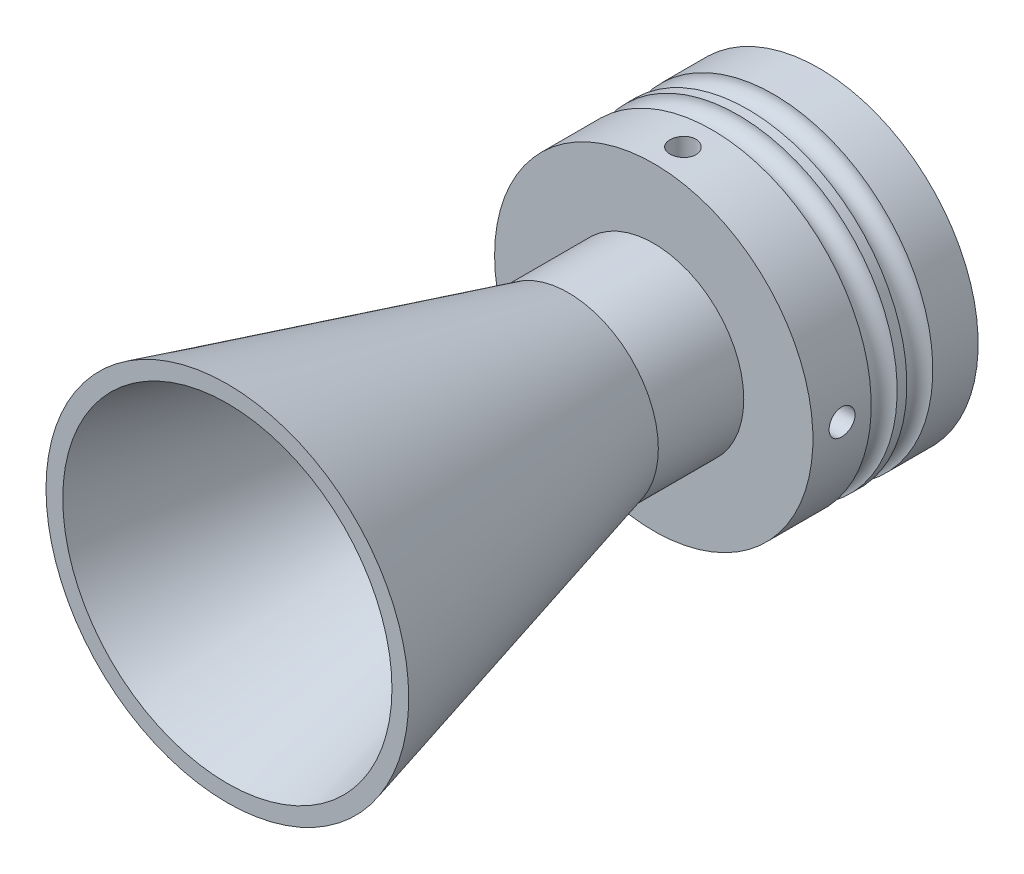
ISO-10303-21;
HEADER;
FILE_DESCRIPTION(('STEP AP214'),'2;1');
FILE_NAME('part.step','',(''),(''),'','','');
FILE_SCHEMA(('AUTOMOTIVE_DESIGN { 1 0 10303 214 1 1 1 1 }'));
ENDSEC;
DATA;
#1=APPLICATION_CONTEXT('core data for automotive mechanical design processes');
#2=APPLICATION_PROTOCOL_DEFINITION('international standard','automotive_design',2000,#1);
#3=PRODUCT_CONTEXT('',#1,'mechanical');
#4=PRODUCT('Part','Part','',(#3));
#5=PRODUCT_RELATED_PRODUCT_CATEGORY('part','',(#4));
#6=PRODUCT_DEFINITION_FORMATION('','',#4);
#7=PRODUCT_DEFINITION_CONTEXT('part definition',#1,'design');
#8=PRODUCT_DEFINITION('design','',#6,#7);
#9=PRODUCT_DEFINITION_SHAPE('','',#8);
#10=(LENGTH_UNIT() NAMED_UNIT(*) SI_UNIT(.MILLI.,.METRE.));
#11=(NAMED_UNIT(*) PLANE_ANGLE_UNIT() SI_UNIT($,.RADIAN.));
#12=(NAMED_UNIT(*) SI_UNIT($,.STERADIAN.) SOLID_ANGLE_UNIT());
#13=UNCERTAINTY_MEASURE_WITH_UNIT(LENGTH_MEASURE(1.E-05),#10,'distance_accuracy_value','');
#14=(GEOMETRIC_REPRESENTATION_CONTEXT(3) GLOBAL_UNCERTAINTY_ASSIGNED_CONTEXT((#13)) GLOBAL_UNIT_ASSIGNED_CONTEXT((#10,
#11,#12)) REPRESENTATION_CONTEXT('',''));
#15=CARTESIAN_POINT('',(0.,0.,0.));
#16=DIRECTION('',(0.,0.,1.));
#17=DIRECTION('',(1.,0.,0.));
#18=AXIS2_PLACEMENT_3D('',#15,#16,#17);
#19=CARTESIAN_POINT('',(0.,0.,-75.3084405577299));
#20=DIRECTION('',(0.,0.,-1.));
#21=DIRECTION('',(-1.,0.,0.));
#22=AXIS2_PLACEMENT_3D('',#19,#20,#21);
#23=CYLINDRICAL_SURFACE('',#22,24.5618);
#24=CARTESIAN_POINT('',(0.,0.,-27.1443538460579));
#25=DIRECTION('',(0.,0.,-1.));
#26=DIRECTION('',(-1.,0.,0.));
#27=AXIS2_PLACEMENT_3D('',#24,#25,#26);
#28=CIRCLE('',#27,24.5618);
#29=CARTESIAN_POINT('',(-24.5618,0.,-27.1443538460579));
#30=VERTEX_POINT('',#29);
#31=EDGE_CURVE('E117',#30,#30,#28,.T.);
#32=ORIENTED_EDGE('',*,*,#31,.F.);
#33=EDGE_LOOP('',(#32));
#34=FACE_BOUND('',#33,.T.);
#35=CARTESIAN_POINT('',(0.,0.,-20.1443538460579));
#36=DIRECTION('',(0.,0.,-1.));
#37=DIRECTION('',(-1.,0.,0.));
#38=AXIS2_PLACEMENT_3D('',#35,#36,#37);
#39=CIRCLE('',#38,24.5618);
#40=CARTESIAN_POINT('',(-24.5618,0.,-20.1443538460579));
#41=VERTEX_POINT('',#40);
#42=EDGE_CURVE('E84',#41,#41,#39,.T.);
#43=ORIENTED_EDGE('',*,*,#42,.T.);
#44=EDGE_LOOP('',(#43));
#45=FACE_BOUND('',#44,.T.);
#46=ADVANCED_FACE('F39',(#34,#45),#23,.T.);
#47=CARTESIAN_POINT('',(0.,0.,-27.1443538460579));
#48=DIRECTION('',(0.,0.,-1.));
#49=DIRECTION('',(-1.,0.,0.));
#50=AXIS2_PLACEMENT_3D('',#47,#48,#49);
#51=CONICAL_SURFACE('',#50,24.5618,0.5235987755983);
#52=CARTESIAN_POINT('',(0.,0.,0.));
#53=DIRECTION('',(0.,0.,-1.));
#54=DIRECTION('',(-1.,0.,0.));
#55=AXIS2_PLACEMENT_3D('',#52,#53,#54);
#56=CIRCLE('',#55,8.89000000000001);
#57=CARTESIAN_POINT('',(-8.89000000000001,0.,0.));
#58=VERTEX_POINT('',#57);
#59=EDGE_CURVE('E114',#58,#58,#56,.T.);
#60=ORIENTED_EDGE('',*,*,#59,.F.);
#61=EDGE_LOOP('',(#60));
#62=FACE_BOUND('',#61,.T.);
#63=ORIENTED_EDGE('',*,*,#31,.T.);
#64=EDGE_LOOP('',(#63));
#65=FACE_BOUND('',#64,.T.);
#66=ADVANCED_FACE('F165',(#62,#65),#51,.F.);
#67=CARTESIAN_POINT('',(0.,0.,-75.3084405577299));
#68=DIRECTION('',(0.,0.,-1.));
#69=DIRECTION('',(-1.,0.,0.));
#70=AXIS2_PLACEMENT_3D('',#67,#68,#69);
#71=CYLINDRICAL_SURFACE('',#70,8.89000000000001);
#72=CARTESIAN_POINT('',(0.,0.,2.54));
#73=DIRECTION('',(0.,0.,-1.));
#74=DIRECTION('',(-1.,0.,0.));
#75=AXIS2_PLACEMENT_3D('',#72,#73,#74);
#76=CIRCLE('',#75,8.89000000000001);
#77=CARTESIAN_POINT('',(-8.89000000000001,0.,2.54));
#78=VERTEX_POINT('',#77);
#79=EDGE_CURVE('E111',#78,#78,#76,.T.);
#80=ORIENTED_EDGE('',*,*,#79,.F.);
#81=EDGE_LOOP('',(#80));
#82=FACE_BOUND('',#81,.T.);
#83=ORIENTED_EDGE('',*,*,#59,.T.);
#84=EDGE_LOOP('',(#83));
#85=FACE_BOUND('',#84,.T.);
#86=ADVANCED_FACE('F170',(#82,#85),#71,.F.);
#87=CARTESIAN_POINT('',(0.,0.,2.54));
#88=DIRECTION('',(0.,0.,1.));
#89=DIRECTION('',(1.,0.,0.));
#90=AXIS2_PLACEMENT_3D('',#87,#88,#89);
#91=CONICAL_SURFACE('',#90,8.89000000000001,0.26179938779915);
#92=CARTESIAN_POINT('',(0.,0.,64.1561588329619));
#93=DIRECTION('',(0.,0.,-1.));
#94=DIRECTION('',(-1.,0.,0.));
#95=AXIS2_PLACEMENT_3D('',#92,#93,#94);
#96=CIRCLE('',#95,25.4);
#97=CARTESIAN_POINT('',(-25.4,0.,64.1561588329619));
#98=VERTEX_POINT('',#97);
#99=EDGE_CURVE('E108',#98,#98,#96,.T.);
#100=ORIENTED_EDGE('',*,*,#99,.F.);
#101=EDGE_LOOP('',(#100));
#102=FACE_BOUND('',#101,.T.);
#103=ORIENTED_EDGE('',*,*,#79,.T.);
#104=EDGE_LOOP('',(#103));
#105=FACE_BOUND('',#104,.T.);
#106=ADVANCED_FACE('F182',(#102,#105),#91,.F.);
#107=CARTESIAN_POINT('',(25.4,0.,64.156158832962));
#108=DIRECTION('',(0.,0.,-1.));
#109=DIRECTION('',(-1.,0.,0.));
#110=AXIS2_PLACEMENT_3D('',#107,#108,#109);
#111=PLANE('',#110);
#112=CARTESIAN_POINT('',(0.,0.,64.1561588329619));
#113=DIRECTION('',(0.,0.,-1.));
#114=DIRECTION('',(-1.,0.,0.));
#115=AXIS2_PLACEMENT_3D('',#112,#113,#114);
#116=CIRCLE('',#115,27.9881904510252);
#117=CARTESIAN_POINT('',(-27.9881904510252,0.,64.1561588329619));
#118=VERTEX_POINT('',#117);
#119=EDGE_CURVE('E105',#118,#118,#116,.T.);
#120=ORIENTED_EDGE('',*,*,#119,.F.);
#121=EDGE_LOOP('',(#120));
#122=FACE_BOUND('',#121,.T.);
#123=ORIENTED_EDGE('',*,*,#99,.T.);
#124=EDGE_LOOP('',(#123));
#125=FACE_BOUND('',#124,.T.);
#126=ADVANCED_FACE('F189',(#122,#125),#111,.F.);
#127=CARTESIAN_POINT('',(0.,0.,64.1561588329619));
#128=DIRECTION('',(0.,0.,1.));
#129=DIRECTION('',(1.,0.,0.));
#130=AXIS2_PLACEMENT_3D('',#127,#128,#129);
#131=CONICAL_SURFACE('',#130,27.9881904510252,0.261799387799151);
#132=CARTESIAN_POINT('',(0.,0.,11.5409957749537));
#133=DIRECTION('',(0.,0.,-1.));
#134=DIRECTION('',(-1.,0.,0.));
#135=AXIS2_PLACEMENT_3D('',#132,#133,#134);
#136=CIRCLE('',#135,13.89);
#137=CARTESIAN_POINT('',(-13.89,0.,11.5409957749537));
#138=VERTEX_POINT('',#137);
#139=EDGE_CURVE('E102',#138,#138,#136,.T.);
#140=ORIENTED_EDGE('',*,*,#139,.F.);
#141=EDGE_LOOP('',(#140));
#142=FACE_BOUND('',#141,.T.);
#143=ORIENTED_EDGE('',*,*,#119,.T.);
#144=EDGE_LOOP('',(#143));
#145=FACE_BOUND('',#144,.T.);
#146=ADVANCED_FACE('F193',(#142,#145),#131,.T.);
#147=CARTESIAN_POINT('',(0.,0.,-75.3084405577299));
#148=DIRECTION('',(0.,0.,-1.));
#149=DIRECTION('',(-1.,0.,0.));
#150=AXIS2_PLACEMENT_3D('',#147,#148,#149);
#151=CYLINDRICAL_SURFACE('',#150,13.89);
#152=CARTESIAN_POINT('',(0.,0.,-1.64435384605786));
#153=DIRECTION('',(0.,0.,-1.));
#154=DIRECTION('',(-1.,0.,0.));
#155=AXIS2_PLACEMENT_3D('',#152,#153,#154);
#156=CIRCLE('',#155,13.89);
#157=CARTESIAN_POINT('',(-13.89,0.,-1.64435384605786));
#158=VERTEX_POINT('',#157);
#159=EDGE_CURVE('E99',#158,#158,#156,.T.);
#160=ORIENTED_EDGE('',*,*,#159,.F.);
#161=EDGE_LOOP('',(#160));
#162=FACE_BOUND('',#161,.T.);
#163=ORIENTED_EDGE('',*,*,#139,.T.);
#164=EDGE_LOOP('',(#163));
#165=FACE_BOUND('',#164,.T.);
#166=ADVANCED_FACE('F197',(#162,#165),#151,.T.);
#167=CARTESIAN_POINT('',(13.89,0.,-1.64435384605787));
#168=DIRECTION('',(0.,0.,-1.));
#169=DIRECTION('',(-1.,0.,0.));
#170=AXIS2_PLACEMENT_3D('',#167,#168,#169);
#171=PLANE('',#170);
#172=CARTESIAN_POINT('',(0.,0.,-1.64435384605786));
#173=DIRECTION('',(0.,0.,-1.));
#174=DIRECTION('',(-1.,0.,0.));
#175=AXIS2_PLACEMENT_3D('',#172,#173,#174);
#176=CIRCLE('',#175,24.5618);
#177=CARTESIAN_POINT('',(-24.5618,0.,-1.64435384605786));
#178=VERTEX_POINT('',#177);
#179=EDGE_CURVE('E96',#178,#178,#176,.T.);
#180=ORIENTED_EDGE('',*,*,#179,.F.);
#181=EDGE_LOOP('',(#180));
#182=FACE_BOUND('',#181,.T.);
#183=ORIENTED_EDGE('',*,*,#159,.T.);
#184=EDGE_LOOP('',(#183));
#185=FACE_BOUND('',#184,.T.);
#186=ADVANCED_FACE('F160',(#182,#185),#171,.F.);
#187=CARTESIAN_POINT('',(0.,0.,-75.3084405577299));
#188=DIRECTION('',(0.,0.,-1.));
#189=DIRECTION('',(-1.,0.,0.));
#190=AXIS2_PLACEMENT_3D('',#187,#188,#189);
#191=CYLINDRICAL_SURFACE('',#190,24.5618);
#192=CARTESIAN_POINT('',(0.,24.5618,-4.14435384605787));
#193=CARTESIAN_POINT('',(-0.112141593484284,24.5617989315381,-4.14435874811145));
#194=CARTESIAN_POINT('',(-0.224359753682799,24.5610238041837,-4.15381737125759));
#195=CARTESIAN_POINT('',(-0.445691870877797,24.5580061929669,-4.19141078284148));
#196=CARTESIAN_POINT('',(-0.554802154040363,24.5557620420353,-4.21956678986824));
#197=CARTESIAN_POINT('',(-0.76668086212744,24.5500600119672,-4.29373593751335));
#198=CARTESIAN_POINT('',(-0.869452812845445,24.5466028148983,-4.33973904465828));
#199=CARTESIAN_POINT('',(-1.06579142249106,24.5388625155217,-4.4482787512852));
#200=CARTESIAN_POINT('',(-1.15936005884735,24.5345795912182,-4.51081178844397));
#201=CARTESIAN_POINT('',(-1.33488912846614,24.5256568334725,-4.65080123813603));
#202=CARTESIAN_POINT('',(-1.4168240164639,24.5210162481033,-4.72828963608943));
#203=CARTESIAN_POINT('',(-1.56654063553194,24.5119075106196,-4.89592272796304));
#204=CARTESIAN_POINT('',(-1.63432174808216,24.5074393660477,-4.98606797469985));
#205=CARTESIAN_POINT('',(-1.75389264893964,24.4991732510783,-5.17660979689365));
#206=CARTESIAN_POINT('',(-1.80566007898563,24.4953762208288,-5.27702044713277));
#207=CARTESIAN_POINT('',(-1.89159128999419,24.4888907359153,-5.4851446433521));
#208=CARTESIAN_POINT('',(-1.92575536924911,24.4862022624667,-5.59285806555036));
#209=CARTESIAN_POINT('',(-1.97543622928937,24.4822445277374,-5.81227496931943));
#210=CARTESIAN_POINT('',(-1.99099451343345,24.4809721081522,-5.92396899570661));
#211=CARTESIAN_POINT('',(-2.00315034735945,24.4799805359079,-6.14838983226583));
#212=CARTESIAN_POINT('',(-1.99974823837185,24.4802613552951,-6.26111662381474));
#213=CARTESIAN_POINT('',(-1.97411417310895,24.4823416649176,-6.48411883851087));
#214=CARTESIAN_POINT('',(-1.95192730226052,24.4841375188718,-6.59439948287932));
#215=CARTESIAN_POINT('',(-1.88942355030596,24.489039839819,-6.80966628066148));
#216=CARTESIAN_POINT('',(-1.84910649915756,24.4921463191043,-6.91465238440762));
#217=CARTESIAN_POINT('',(-1.75143628711684,24.4993240464494,-7.11649373201899));
#218=CARTESIAN_POINT('',(-1.69406287524686,24.5033964401687,-7.21333913412472));
#219=CARTESIAN_POINT('',(-1.56392316815058,24.5120460643315,-7.39604236984987));
#220=CARTESIAN_POINT('',(-1.49115657548718,24.5166233045293,-7.48189999110476));
#221=CARTESIAN_POINT('',(-1.33204310256705,24.5257830444986,-7.64045264753241));
#222=CARTESIAN_POINT('',(-1.24565724111137,24.5303655206868,-7.71310857074023));
#223=CARTESIAN_POINT('',(-1.06189347076513,24.5390066648017,-7.84289306470512));
#224=CARTESIAN_POINT('',(-0.964515554959158,24.5430653323989,-7.90002162569339));
#225=CARTESIAN_POINT('',(-0.761506630046313,24.5502022750295,-7.99712720033692));
#226=CARTESIAN_POINT('',(-0.655874801100778,24.5532804525189,-8.03710250763984));
#227=CARTESIAN_POINT('',(-0.439368106974057,24.5581084499974,-8.0987395689671));
#228=CARTESIAN_POINT('',(-0.328493345726816,24.5598582963071,-8.12040168586476));
#229=CARTESIAN_POINT('',(-0.104987164495274,24.5618290904761,-8.14474848032969));
#230=CARTESIAN_POINT('',(0.0076383333010981,24.5620543911013,-8.14748718703832));
#231=CARTESIAN_POINT('',(0.231746894714884,24.5609623288912,-8.1340509187828));
#232=CARTESIAN_POINT('',(0.343229968490891,24.5596449797854,-8.11787611214773));
#233=CARTESIAN_POINT('',(0.561735222455953,24.5556185842572,-8.0671167370458));
#234=CARTESIAN_POINT('',(0.668763251956354,24.5529114291862,-8.03255718559925));
#235=CARTESIAN_POINT('',(0.875501407121716,24.5464095806382,-7.94603487634939));
#236=CARTESIAN_POINT('',(0.975211422133711,24.5426148707209,-7.89407185546079));
#237=CARTESIAN_POINT('',(1.16472918322411,24.5343525505745,-7.77408168900205));
#238=CARTESIAN_POINT('',(1.25451418216037,24.5298834479219,-7.70601871994223));
#239=CARTESIAN_POINT('',(1.4214036910347,24.5207795496767,-7.55581250407189));
#240=CARTESIAN_POINT('',(1.49850799057751,24.5161447513364,-7.47366902368693));
#241=CARTESIAN_POINT('',(1.63803248389374,24.5072189736169,-7.29739922260193));
#242=CARTESIAN_POINT('',(1.70041744147482,24.502928835165,-7.20324496259505));
#243=CARTESIAN_POINT('',(1.80849082929525,24.4951899013911,-7.00576550443095));
#244=CARTESIAN_POINT('',(1.85417941976015,24.4917410979954,-6.902440394293));
#245=CARTESIAN_POINT('',(1.92750301656592,24.4860799528597,-6.68967742881287));
#246=CARTESIAN_POINT('',(1.9551596554701,24.4838661300012,-6.58024706962489));
#247=CARTESIAN_POINT('',(1.99170473323817,24.4809205894277,-6.35827713287327));
#248=CARTESIAN_POINT('',(2.00059351439776,24.480188844682,-6.2457376120537));
#249=CARTESIAN_POINT('',(1.9993466786577,24.480290681317,-6.0210941229522));
#250=CARTESIAN_POINT('',(1.98926642817877,24.4811197071557,-5.90898984114361));
#251=CARTESIAN_POINT('',(1.95048305264641,24.4842399975029,-5.68807196734506));
#252=CARTESIAN_POINT('',(1.92177989854078,24.4865312642925,-5.57925838048896));
#253=CARTESIAN_POINT('',(1.84657937422165,24.4923166738984,-5.36800665859296));
#254=CARTESIAN_POINT('',(1.80008293099049,24.4958107540505,-5.26556819174969));
#255=CARTESIAN_POINT('',(1.69062199128293,24.5036081825676,-5.06994234042215));
#256=CARTESIAN_POINT('',(1.62765777053335,24.5079115173826,-4.97675480108181));
#257=CARTESIAN_POINT('',(1.48684069912956,24.5168574897544,-4.80199285502212));
#258=CARTESIAN_POINT('',(1.40894691182899,24.5215010380279,-4.72045148042844));
#259=CARTESIAN_POINT('',(1.24055490572318,24.5305959311298,-4.571568019929));
#260=CARTESIAN_POINT('',(1.15005363825368,24.5350472291275,-4.50422937837309));
#261=CARTESIAN_POINT('',(0.958848784812308,24.5432637395329,-4.38557692814964));
#262=CARTESIAN_POINT('',(0.858127172153495,24.5470277057108,-4.33429210946005));
#263=CARTESIAN_POINT('',(0.649541116056349,24.55343067707,-4.24942754205893));
#264=CARTESIAN_POINT('',(0.541685061367675,24.5560709772283,-4.2158274018796));
#265=CARTESIAN_POINT('',(0.360991871524487,24.5592498609918,-4.17586145108481));
#266=CARTESIAN_POINT('',(0.289317448558753,24.5602018203546,-4.16406175927214));
#267=CARTESIAN_POINT('',(0.145106036745532,24.5614772347798,-4.14830638051456));
#268=CARTESIAN_POINT('',(0.0725690500678836,24.5618006914229,-4.14435067384174));
#269=CARTESIAN_POINT('',(0.,24.5618,-4.14435384605787));
#270=B_SPLINE_CURVE_WITH_KNOTS('',3,(#192,#193,#194,#195,#196,#197,#198,#199,#200,#201,#202,
#203,#204,#205,#206,#207,#208,#209,#210,#211,#212,#213,#214,#215,#216,#217,#218,#219,#220,#221,
#222,#223,#224,#225,#226,#227,#228,#229,#230,#231,#232,#233,#234,#235,#236,#237,#238,#239,#240,
#241,#242,#243,#244,#245,#246,#247,#248,#249,#250,#251,#252,#253,#254,#255,#256,#257,#258,#259,
#260,#261,#262,#263,#264,#265,#266,#267,#268,#269),.UNSPECIFIED.,.T.,.F.,(4,2,2,2,2,2,2,2,2,2,2,
2,2,2,2,2,2,2,2,2,2,2,2,2,2,2,2,2,2,2,2,2,2,2,2,2,2,2,4),(0.,0.336159827874987,
0.672701797698236,1.0090548402966,1.34533545531821,1.68234341603319,2.01936610091733,
2.35685723401653,2.69434264807169,3.03107383142367,3.36779895463901,3.70371818528233,
4.03964056656492,4.37596339151666,4.71229271571156,5.04960277158238,5.38691303966608,
5.7242568545518,6.06159398486005,6.39796756819627,6.73433815785192,7.07025219804378,
7.40617131642046,7.74284502783746,8.07952432470397,8.41700159120252,8.75447561903851,
9.09154403758109,9.42860630848187,9.76468629459758,10.1007668050078,10.4368298089137,
10.7728871863381,11.1098795630184,11.4469535710586,11.7846328017556,12.1219218108085,
12.3394580520542,12.5569937461879),.UNSPECIFIED.);
#271=CARTESIAN_POINT('',(0.,24.5618,-4.14435384605787));
#272=VERTEX_POINT('',#271);
#273=EDGE_CURVE('E11',#272,#272,#270,.T.);
#274=ORIENTED_EDGE('',*,*,#273,.T.);
#275=EDGE_LOOP('',(#274));
#276=FACE_BOUND('',#275,.T.);
#277=CARTESIAN_POINT('',(24.5618,0.,-8.14435384605786));
#278=CARTESIAN_POINT('',(24.5617989315381,-0.112141593484284,-8.14434894400429));
#279=CARTESIAN_POINT('',(24.5610238041837,-0.224359753682799,-8.13489032085814));
#280=CARTESIAN_POINT('',(24.5580061929669,-0.445691870877796,-8.09729690927425));
#281=CARTESIAN_POINT('',(24.5557620420353,-0.554802154040362,-8.06914090224749));
#282=CARTESIAN_POINT('',(24.5500600119672,-0.766680862127437,-7.99497175460237));
#283=CARTESIAN_POINT('',(24.5466028148983,-0.86945281284544,-7.94896864745743));
#284=CARTESIAN_POINT('',(24.5388625155217,-1.06579142249106,-7.84042894083051));
#285=CARTESIAN_POINT('',(24.5345795912182,-1.15936005884734,-7.77789590367174));
#286=CARTESIAN_POINT('',(24.5256568334725,-1.33488912846613,-7.63790645397968));
#287=CARTESIAN_POINT('',(24.5210162481033,-1.41682401646388,-7.56041805602627));
#288=CARTESIAN_POINT('',(24.5119075106196,-1.56654063553193,-7.39278496415266));
#289=CARTESIAN_POINT('',(24.5074393660477,-1.63432174808214,-7.30263971741585));
#290=CARTESIAN_POINT('',(24.4991732510783,-1.75389264893961,-7.11209789522205));
#291=CARTESIAN_POINT('',(24.4953762208288,-1.8056600789856,-7.01168724498293));
#292=CARTESIAN_POINT('',(24.4888907359153,-1.89159128999416,-6.80356304876359));
#293=CARTESIAN_POINT('',(24.4862022624667,-1.92575536924908,-6.69584962656533));
#294=CARTESIAN_POINT('',(24.4822445277374,-1.97543622928933,-6.47643272279626));
#295=CARTESIAN_POINT('',(24.4809721081522,-1.99099451343341,-6.36473869640908));
#296=CARTESIAN_POINT('',(24.4799805359079,-2.00315034735941,-6.14031785984986));
#297=CARTESIAN_POINT('',(24.4802613552951,-1.99974823837181,-6.02759106830096));
#298=CARTESIAN_POINT('',(24.4823416649176,-1.9741141731089,-5.80458885360483));
#299=CARTESIAN_POINT('',(24.4841375188718,-1.95192730226047,-5.69430820923637));
#300=CARTESIAN_POINT('',(24.489039839819,-1.88942355030591,-5.47904141145422));
#301=CARTESIAN_POINT('',(24.4921463191043,-1.8491064991575,-5.37405530770808));
#302=CARTESIAN_POINT('',(24.4993240464494,-1.75143628711678,-5.17221396009671));
#303=CARTESIAN_POINT('',(24.5033964401687,-1.69406287524679,-5.07536855799098));
#304=CARTESIAN_POINT('',(24.5120460643315,-1.56392316815051,-4.89266532226583));
#305=CARTESIAN_POINT('',(24.5166233045293,-1.4911565754871,-4.80680770101095));
#306=CARTESIAN_POINT('',(24.5257830444986,-1.33204310256698,-4.6482550445833));
#307=CARTESIAN_POINT('',(24.5303655206868,-1.24565724111129,-4.57559912137548));
#308=CARTESIAN_POINT('',(24.5390066648017,-1.06189347076505,-4.44581462741059));
#309=CARTESIAN_POINT('',(24.5430653323989,-0.964515554959076,-4.38868606642232));
#310=CARTESIAN_POINT('',(24.5502022750295,-0.761506630046229,-4.2915804917788));
#311=CARTESIAN_POINT('',(24.5532804525189,-0.655874801100693,-4.25160518447588));
#312=CARTESIAN_POINT('',(24.5581084499974,-0.439368106973971,-4.18996812314863));
#313=CARTESIAN_POINT('',(24.5598582963071,-0.32849334572673,-4.16830600625096));
#314=CARTESIAN_POINT('',(24.5618290904761,-0.104987164495188,-4.14395921178604));
#315=CARTESIAN_POINT('',(24.5620543911013,0.0076383333011845,-4.14122050507742));
#316=CARTESIAN_POINT('',(24.5609623288912,0.231746894714971,-4.15465677333293));
#317=CARTESIAN_POINT('',(24.5596449797854,0.343229968490977,-4.17083157996802));
#318=CARTESIAN_POINT('',(24.5556185842572,0.561735222456038,-4.22159095506995));
#319=CARTESIAN_POINT('',(24.5529114291862,0.668763251956438,-4.2561505065165));
#320=CARTESIAN_POINT('',(24.5464095806382,0.875501407121798,-4.34267281576636));
#321=CARTESIAN_POINT('',(24.5426148707209,0.975211422133793,-4.39463583665496));
#322=CARTESIAN_POINT('',(24.5343525505745,1.16472918322419,-4.51462600311371));
#323=CARTESIAN_POINT('',(24.5298834479219,1.25451418216045,-4.58268897217353));
#324=CARTESIAN_POINT('',(24.5207795496767,1.42140369103478,-4.73289518804387));
#325=CARTESIAN_POINT('',(24.5161447513364,1.49850799057759,-4.81503866842883));
#326=CARTESIAN_POINT('',(24.5072189736169,1.63803248389381,-4.99130846951384));
#327=CARTESIAN_POINT('',(24.502928835165,1.70041744147489,-5.08546272952072));
#328=CARTESIAN_POINT('',(24.4951899013911,1.80849082929531,-5.28294218768482));
#329=CARTESIAN_POINT('',(24.4917410979953,1.85417941976021,-5.38626729782277));
#330=CARTESIAN_POINT('',(24.4860799528597,1.92750301656598,-5.5990302633029));
#331=CARTESIAN_POINT('',(24.4838661300012,1.95515965547015,-5.70846062249088));
#332=CARTESIAN_POINT('',(24.4809205894277,1.99170473323822,-5.9304305592425));
#333=CARTESIAN_POINT('',(24.480188844682,2.00059351439781,-6.04297008006208));
#334=CARTESIAN_POINT('',(24.480290681317,1.99934667865775,-6.26761356916358));
#335=CARTESIAN_POINT('',(24.4811197071557,1.98926642817881,-6.37971785097217));
#336=CARTESIAN_POINT('',(24.4842399975029,1.95048305264644,-6.60063572477071));
#337=CARTESIAN_POINT('',(24.4865312642924,1.92177989854081,-6.70944931162682));
#338=CARTESIAN_POINT('',(24.4923166738984,1.84657937422168,-6.92070103352282));
#339=CARTESIAN_POINT('',(24.4958107540505,1.80008293099051,-7.02313950036609));
#340=CARTESIAN_POINT('',(24.5036081825676,1.69062199128295,-7.21876535169362));
#341=CARTESIAN_POINT('',(24.5079115173826,1.62765777053337,-7.31195289103396));
#342=CARTESIAN_POINT('',(24.5168574897544,1.48684069912958,-7.48671483709364));
#343=CARTESIAN_POINT('',(24.5215010380278,1.408946911829,-7.56825621168733));
#344=CARTESIAN_POINT('',(24.5305959311298,1.24055490572319,-7.71713967218677));
#345=CARTESIAN_POINT('',(24.5350472291275,1.15005363825369,-7.78447831374267));
#346=CARTESIAN_POINT('',(24.5432637395329,0.958848784812313,-7.90313076396612));
#347=CARTESIAN_POINT('',(24.5470277057108,0.858127172153499,-7.9544155826557));
#348=CARTESIAN_POINT('',(24.55343067707,0.649541116056351,-8.03928015005682));
#349=CARTESIAN_POINT('',(24.5560709772283,0.541685061367677,-8.07288029023615));
#350=CARTESIAN_POINT('',(24.5592498609918,0.360991871524487,-8.11284624103093));
#351=CARTESIAN_POINT('',(24.5602018203546,0.289317448558754,-8.1246459328436));
#352=CARTESIAN_POINT('',(24.5614772347798,0.145106036745533,-8.14040131160118));
#353=CARTESIAN_POINT('',(24.5618006914229,0.0725690500678837,-8.14435701827399));
#354=CARTESIAN_POINT('',(24.5618,0.,-8.14435384605786));
#355=B_SPLINE_CURVE_WITH_KNOTS('',3,(#277,#278,#279,#280,#281,#282,#283,#284,#285,#286,#287,
#288,#289,#290,#291,#292,#293,#294,#295,#296,#297,#298,#299,#300,#301,#302,#303,#304,#305,#306,
#307,#308,#309,#310,#311,#312,#313,#314,#315,#316,#317,#318,#319,#320,#321,#322,#323,#324,#325,
#326,#327,#328,#329,#330,#331,#332,#333,#334,#335,#336,#337,#338,#339,#340,#341,#342,#343,#344,
#345,#346,#347,#348,#349,#350,#351,#352,#353,#354),.UNSPECIFIED.,.T.,.F.,(4,2,2,2,2,2,2,2,2,2,2,
2,2,2,2,2,2,2,2,2,2,2,2,2,2,2,2,2,2,2,2,2,2,2,2,2,2,2,4),(0.,0.336159827874987,
0.672701797698236,1.0090548402966,1.34533545531821,1.68234341603319,2.01936610091733,
2.35685723401653,2.69434264807169,3.03107383142367,3.36779895463901,3.70371818528233,
4.03964056656492,4.37596339151666,4.71229271571156,5.04960277158238,5.38691303966608,
5.72425685455181,6.06159398486005,6.39796756819628,6.73433815785193,7.07025219804378,
7.40617131642046,7.74284502783746,8.07952432470397,8.41700159120252,8.75447561903851,
9.0915440375811,9.42860630848187,9.76468629459758,10.1007668050078,10.4368298089137,
10.7728871863381,11.1098795630184,11.4469535710586,11.7846328017556,12.1219218108085,
12.3394580520542,12.556993746188),.UNSPECIFIED.);
#356=CARTESIAN_POINT('',(24.5618,0.,-8.14435384605786));
#357=VERTEX_POINT('',#356);
#358=EDGE_CURVE('E51',#357,#357,#355,.T.);
#359=ORIENTED_EDGE('',*,*,#358,.T.);
#360=EDGE_LOOP('',(#359));
#361=FACE_BOUND('',#360,.T.);
#362=CARTESIAN_POINT('',(0.,-24.5618,-8.14435384605786));
#363=CARTESIAN_POINT('',(-0.112141593484284,-24.5617989315381,-8.14434894400428));
#364=CARTESIAN_POINT('',(-0.224359753682799,-24.5610238041837,-8.13489032085813));
#365=CARTESIAN_POINT('',(-0.445691870877797,-24.5580061929669,-8.09729690927425));
#366=CARTESIAN_POINT('',(-0.554802154040364,-24.5557620420353,-8.06914090224749));
#367=CARTESIAN_POINT('',(-0.76668086212744,-24.5500600119672,-7.99497175460238));
#368=CARTESIAN_POINT('',(-0.869452812845446,-24.5466028148983,-7.94896864745744));
#369=CARTESIAN_POINT('',(-1.06579142249106,-24.5388625155217,-7.84042894083053));
#370=CARTESIAN_POINT('',(-1.15936005884735,-24.5345795912182,-7.77789590367176));
#371=CARTESIAN_POINT('',(-1.33488912846614,-24.5256568334725,-7.6379064539797));
#372=CARTESIAN_POINT('',(-1.4168240164639,-24.5210162481033,-7.5604180560263));
#373=CARTESIAN_POINT('',(-1.56654063553194,-24.5119075106196,-7.39278496415268));
#374=CARTESIAN_POINT('',(-1.63432174808216,-24.5074393660477,-7.30263971741587));
#375=CARTESIAN_POINT('',(-1.75389264893964,-24.4991732510783,-7.11209789522208));
#376=CARTESIAN_POINT('',(-1.80566007898563,-24.4953762208288,-7.01168724498296));
#377=CARTESIAN_POINT('',(-1.89159128999419,-24.4888907359153,-6.80356304876363));
#378=CARTESIAN_POINT('',(-1.92575536924911,-24.4862022624667,-6.69584962656537));
#379=CARTESIAN_POINT('',(-1.97543622928937,-24.4822445277374,-6.47643272279629));
#380=CARTESIAN_POINT('',(-1.99099451343345,-24.4809721081522,-6.36473869640912));
#381=CARTESIAN_POINT('',(-2.00315034735945,-24.4799805359079,-6.14031785984989));
#382=CARTESIAN_POINT('',(-1.99974823837185,-24.4802613552951,-6.02759106830099));
#383=CARTESIAN_POINT('',(-1.97411417310895,-24.4823416649176,-5.80458885360486));
#384=CARTESIAN_POINT('',(-1.95192730226052,-24.4841375188718,-5.69430820923641));
#385=CARTESIAN_POINT('',(-1.88942355030596,-24.489039839819,-5.47904141145425));
#386=CARTESIAN_POINT('',(-1.84910649915756,-24.4921463191043,-5.37405530770811));
#387=CARTESIAN_POINT('',(-1.75143628711684,-24.4993240464494,-5.17221396009674));
#388=CARTESIAN_POINT('',(-1.69406287524686,-24.5033964401687,-5.07536855799101));
#389=CARTESIAN_POINT('',(-1.56392316815058,-24.5120460643315,-4.89266532226586));
#390=CARTESIAN_POINT('',(-1.49115657548718,-24.5166233045293,-4.80680770101097));
#391=CARTESIAN_POINT('',(-1.33204310256705,-24.5257830444986,-4.64825504458332));
#392=CARTESIAN_POINT('',(-1.24565724111137,-24.5303655206868,-4.5755991213755));
#393=CARTESIAN_POINT('',(-1.06189347076513,-24.5390066648017,-4.4458146274106));
#394=CARTESIAN_POINT('',(-0.964515554959157,-24.5430653323989,-4.38868606642233));
#395=CARTESIAN_POINT('',(-0.761506630046313,-24.5502022750295,-4.29158049177881));
#396=CARTESIAN_POINT('',(-0.655874801100778,-24.5532804525189,-4.25160518447589));
#397=CARTESIAN_POINT('',(-0.439368106974057,-24.5581084499974,-4.18996812314863));
#398=CARTESIAN_POINT('',(-0.328493345726817,-24.5598582963071,-4.16830600625096));
#399=CARTESIAN_POINT('',(-0.104987164495276,-24.5618290904761,-4.14395921178603));
#400=CARTESIAN_POINT('',(0.00763833330109701,-24.5620543911013,-4.14122050507741));
#401=CARTESIAN_POINT('',(0.231746894714884,-24.5609623288912,-4.15465677333292));
#402=CARTESIAN_POINT('',(0.343229968490891,-24.5596449797854,-4.170831579968));
#403=CARTESIAN_POINT('',(0.561735222455953,-24.5556185842572,-4.22159095506993));
#404=CARTESIAN_POINT('',(0.668763251956355,-24.5529114291862,-4.25615050651648));
#405=CARTESIAN_POINT('',(0.875501407121717,-24.5464095806382,-4.34267281576633));
#406=CARTESIAN_POINT('',(0.975211422133712,-24.5426148707209,-4.39463583665493));
#407=CARTESIAN_POINT('',(1.16472918322411,-24.5343525505745,-4.51462600311368));
#408=CARTESIAN_POINT('',(1.25451418216037,-24.5298834479219,-4.5826889721735));
#409=CARTESIAN_POINT('',(1.4214036910347,-24.5207795496767,-4.73289518804384));
#410=CARTESIAN_POINT('',(1.49850799057751,-24.5161447513364,-4.81503866842879));
#411=CARTESIAN_POINT('',(1.63803248389374,-24.5072189736169,-4.99130846951379));
#412=CARTESIAN_POINT('',(1.70041744147482,-24.502928835165,-5.08546272952068));
#413=CARTESIAN_POINT('',(1.80849082929525,-24.4951899013911,-5.28294218768477));
#414=CARTESIAN_POINT('',(1.85417941976015,-24.4917410979954,-5.38626729782273));
#415=CARTESIAN_POINT('',(1.92750301656592,-24.4860799528597,-5.59903026330285));
#416=CARTESIAN_POINT('',(1.9551596554701,-24.4838661300012,-5.70846062249083));
#417=CARTESIAN_POINT('',(1.99170473323817,-24.4809205894277,-5.93043055924245));
#418=CARTESIAN_POINT('',(2.00059351439776,-24.480188844682,-6.04297008006203));
#419=CARTESIAN_POINT('',(1.9993466786577,-24.480290681317,-6.26761356916353));
#420=CARTESIAN_POINT('',(1.98926642817877,-24.4811197071557,-6.37971785097212));
#421=CARTESIAN_POINT('',(1.95048305264641,-24.4842399975029,-6.60063572477067));
#422=CARTESIAN_POINT('',(1.92177989854078,-24.4865312642925,-6.70944931162677));
#423=CARTESIAN_POINT('',(1.84657937422165,-24.4923166738984,-6.92070103352277));
#424=CARTESIAN_POINT('',(1.80008293099048,-24.4958107540505,-7.02313950036604));
#425=CARTESIAN_POINT('',(1.69062199128293,-24.5036081825676,-7.21876535169358));
#426=CARTESIAN_POINT('',(1.62765777053335,-24.5079115173826,-7.31195289103392));
#427=CARTESIAN_POINT('',(1.48684069912956,-24.5168574897544,-7.48671483709361));
#428=CARTESIAN_POINT('',(1.40894691182899,-24.5215010380279,-7.56825621168729));
#429=CARTESIAN_POINT('',(1.24055490572318,-24.5305959311298,-7.71713967218673));
#430=CARTESIAN_POINT('',(1.15005363825368,-24.5350472291275,-7.78447831374263));
#431=CARTESIAN_POINT('',(0.958848784812307,-24.5432637395329,-7.90313076396609));
#432=CARTESIAN_POINT('',(0.858127172153495,-24.5470277057108,-7.95441558265568));
#433=CARTESIAN_POINT('',(0.649541116056348,-24.55343067707,-8.0392801500568));
#434=CARTESIAN_POINT('',(0.541685061367675,-24.5560709772283,-8.07288029023613));
#435=CARTESIAN_POINT('',(0.360991871524485,-24.5592498609918,-8.11284624103092));
#436=CARTESIAN_POINT('',(0.289317448558752,-24.5602018203546,-8.12464593284358));
#437=CARTESIAN_POINT('',(0.145106036745531,-24.5614772347798,-8.14040131160117));
#438=CARTESIAN_POINT('',(0.072569050067883,-24.5618006914229,-8.14435701827398));
#439=CARTESIAN_POINT('',(0.,-24.5618,-8.14435384605786));
#440=B_SPLINE_CURVE_WITH_KNOTS('',3,(#362,#363,#364,#365,#366,#367,#368,#369,#370,#371,#372,
#373,#374,#375,#376,#377,#378,#379,#380,#381,#382,#383,#384,#385,#386,#387,#388,#389,#390,#391,
#392,#393,#394,#395,#396,#397,#398,#399,#400,#401,#402,#403,#404,#405,#406,#407,#408,#409,#410,
#411,#412,#413,#414,#415,#416,#417,#418,#419,#420,#421,#422,#423,#424,#425,#426,#427,#428,#429,
#430,#431,#432,#433,#434,#435,#436,#437,#438,#439),.UNSPECIFIED.,.T.,.F.,(4,2,2,2,2,2,2,2,2,2,2,
2,2,2,2,2,2,2,2,2,2,2,2,2,2,2,2,2,2,2,2,2,2,2,2,2,2,2,4),(0.,0.336159827874987,
0.672701797698236,1.0090548402966,1.34533545531821,1.68234341603319,2.01936610091733,
2.35685723401653,2.69434264807169,3.03107383142367,3.36779895463901,3.70371818528233,
4.03964056656492,4.37596339151666,4.71229271571157,5.04960277158238,5.38691303966608,
5.72425685455181,6.06159398486005,6.39796756819628,6.73433815785193,7.07025219804378,
7.40617131642046,7.74284502783746,8.07952432470397,8.41700159120252,8.75447561903851,
9.0915440375811,9.42860630848187,9.76468629459758,10.1007668050078,10.4368298089137,
10.7728871863381,11.1098795630184,11.4469535710586,11.7846328017556,12.1219218108085,
12.3394580520542,12.556993746188),.UNSPECIFIED.);
#441=CARTESIAN_POINT('',(0.,-24.5618,-8.14435384605786));
#442=VERTEX_POINT('',#441);
#443=EDGE_CURVE('E127',#442,#442,#440,.T.);
#444=ORIENTED_EDGE('',*,*,#443,.T.);
#445=EDGE_LOOP('',(#444));
#446=FACE_BOUND('',#445,.T.);
#447=CARTESIAN_POINT('',(-24.5618,0.,-4.14435384605788));
#448=CARTESIAN_POINT('',(-24.5617989315381,-0.112141593484285,-4.14435874811146));
#449=CARTESIAN_POINT('',(-24.5610238041837,-0.224359753682799,-4.1538173712576));
#450=CARTESIAN_POINT('',(-24.5580061929669,-0.445691870877796,-4.19141078284149));
#451=CARTESIAN_POINT('',(-24.5557620420353,-0.554802154040362,-4.21956678986826));
#452=CARTESIAN_POINT('',(-24.5500600119672,-0.766680862127437,-4.29373593751337));
#453=CARTESIAN_POINT('',(-24.5466028148983,-0.869452812845441,-4.33973904465831));
#454=CARTESIAN_POINT('',(-24.5388625155217,-1.06579142249106,-4.44827875128522));
#455=CARTESIAN_POINT('',(-24.5345795912182,-1.15936005884734,-4.510811788444));
#456=CARTESIAN_POINT('',(-24.5256568334725,-1.33488912846613,-4.65080123813606));
#457=CARTESIAN_POINT('',(-24.5210162481033,-1.41682401646389,-4.72828963608946));
#458=CARTESIAN_POINT('',(-24.5119075106196,-1.56654063553193,-4.89592272796308));
#459=CARTESIAN_POINT('',(-24.5074393660477,-1.63432174808215,-4.98606797469989));
#460=CARTESIAN_POINT('',(-24.4991732510783,-1.75389264893962,-5.17660979689369));
#461=CARTESIAN_POINT('',(-24.4953762208288,-1.80566007898561,-5.27702044713281));
#462=CARTESIAN_POINT('',(-24.4888907359153,-1.89159128999416,-5.48514464335214));
#463=CARTESIAN_POINT('',(-24.4862022624667,-1.92575536924909,-5.5928580655504));
#464=CARTESIAN_POINT('',(-24.4822445277374,-1.97543622928934,-5.81227496931948));
#465=CARTESIAN_POINT('',(-24.4809721081522,-1.99099451343342,-5.92396899570666));
#466=CARTESIAN_POINT('',(-24.4799805359079,-2.00315034735941,-6.14838983226588));
#467=CARTESIAN_POINT('',(-24.4802613552951,-1.99974823837181,-6.26111662381478));
#468=CARTESIAN_POINT('',(-24.4823416649176,-1.9741141731089,-6.48411883851091));
#469=CARTESIAN_POINT('',(-24.4841375188718,-1.95192730226048,-6.59439948287937));
#470=CARTESIAN_POINT('',(-24.489039839819,-1.88942355030591,-6.80966628066152));
#471=CARTESIAN_POINT('',(-24.4921463191043,-1.84910649915751,-6.91465238440766));
#472=CARTESIAN_POINT('',(-24.4993240464494,-1.75143628711678,-7.11649373201903));
#473=CARTESIAN_POINT('',(-24.5033964401687,-1.6940628752468,-7.21333913412475));
#474=CARTESIAN_POINT('',(-24.5120460643315,-1.56392316815051,-7.39604236984991));
#475=CARTESIAN_POINT('',(-24.5166233045293,-1.49115657548711,-7.48189999110479));
#476=CARTESIAN_POINT('',(-24.5257830444986,-1.33204310256699,-7.64045264753244));
#477=CARTESIAN_POINT('',(-24.5303655206868,-1.2456572411113,-7.71310857074026));
#478=CARTESIAN_POINT('',(-24.5390066648017,-1.06189347076506,-7.84289306470515));
#479=CARTESIAN_POINT('',(-24.5430653323989,-0.964515554959086,-7.90002162569342));
#480=CARTESIAN_POINT('',(-24.5502022750295,-0.761506630046239,-7.99712720033694));
#481=CARTESIAN_POINT('',(-24.5532804525189,-0.655874801100703,-8.03710250763986));
#482=CARTESIAN_POINT('',(-24.5581084499974,-0.439368106973981,-8.09873956896711));
#483=CARTESIAN_POINT('',(-24.5598582963071,-0.32849334572674,-8.12040168586478));
#484=CARTESIAN_POINT('',(-24.5618290904761,-0.104987164495198,-8.1447484803297));
#485=CARTESIAN_POINT('',(-24.5620543911013,0.00763833330117431,-8.14748718703833));
#486=CARTESIAN_POINT('',(-24.5609623288912,0.23174689471496,-8.13405091878281));
#487=CARTESIAN_POINT('',(-24.5596449797854,0.343229968490967,-8.11787611214773));
#488=CARTESIAN_POINT('',(-24.5556185842572,0.561735222456028,-8.06711673704579));
#489=CARTESIAN_POINT('',(-24.5529114291862,0.668763251956428,-8.03255718559924));
#490=CARTESIAN_POINT('',(-24.5464095806382,0.875501407121788,-7.94603487634939));
#491=CARTESIAN_POINT('',(-24.5426148707209,0.975211422133783,-7.89407185546078));
#492=CARTESIAN_POINT('',(-24.5343525505745,1.16472918322418,-7.77408168900203));
#493=CARTESIAN_POINT('',(-24.5298834479219,1.25451418216044,-7.70601871994221));
#494=CARTESIAN_POINT('',(-24.5207795496767,1.42140369103477,-7.55581250407187));
#495=CARTESIAN_POINT('',(-24.5161447513364,1.49850799057758,-7.47366902368691));
#496=CARTESIAN_POINT('',(-24.5072189736169,1.6380324838938,-7.29739922260191));
#497=CARTESIAN_POINT('',(-24.502928835165,1.70041744147488,-7.20324496259503));
#498=CARTESIAN_POINT('',(-24.4951899013911,1.8084908292953,-7.00576550443093));
#499=CARTESIAN_POINT('',(-24.4917410979953,1.8541794197602,-6.90244039429297));
#500=CARTESIAN_POINT('',(-24.4860799528597,1.92750301656597,-6.68967742881285));
#501=CARTESIAN_POINT('',(-24.4838661300012,1.95515965547015,-6.58024706962486));
#502=CARTESIAN_POINT('',(-24.4809205894277,1.99170473323821,-6.35827713287325));
#503=CARTESIAN_POINT('',(-24.480188844682,2.0005935143978,-6.24573761205367));
#504=CARTESIAN_POINT('',(-24.480290681317,1.99934667865774,-6.02109412295217));
#505=CARTESIAN_POINT('',(-24.4811197071557,1.9892664281788,-5.90898984114357));
#506=CARTESIAN_POINT('',(-24.4842399975029,1.95048305264644,-5.68807196734503));
#507=CARTESIAN_POINT('',(-24.4865312642925,1.92177989854081,-5.57925838048893));
#508=CARTESIAN_POINT('',(-24.4923166738984,1.84657937422168,-5.36800665859293));
#509=CARTESIAN_POINT('',(-24.4958107540505,1.80008293099051,-5.26556819174966));
#510=CARTESIAN_POINT('',(-24.5036081825676,1.69062199128295,-5.06994234042212));
#511=CARTESIAN_POINT('',(-24.5079115173826,1.62765777053336,-4.97675480108178));
#512=CARTESIAN_POINT('',(-24.5168574897544,1.48684069912957,-4.8019928550221));
#513=CARTESIAN_POINT('',(-24.5215010380278,1.408946911829,-4.72045148042842));
#514=CARTESIAN_POINT('',(-24.5305959311298,1.24055490572319,-4.57156801992898));
#515=CARTESIAN_POINT('',(-24.5350472291275,1.15005363825369,-4.50422937837308));
#516=CARTESIAN_POINT('',(-24.5432637395329,0.958848784812312,-4.38557692814963));
#517=CARTESIAN_POINT('',(-24.5470277057108,0.858127172153498,-4.33429210946004));
#518=CARTESIAN_POINT('',(-24.55343067707,0.64954111605635,-4.24942754205893));
#519=CARTESIAN_POINT('',(-24.5560709772283,0.541685061367677,-4.2158274018796));
#520=CARTESIAN_POINT('',(-24.5592498609918,0.360991871524487,-4.17586145108481));
#521=CARTESIAN_POINT('',(-24.5602018203546,0.289317448558754,-4.16406175927215));
#522=CARTESIAN_POINT('',(-24.5614772347798,0.145106036745533,-4.14830638051456));
#523=CARTESIAN_POINT('',(-24.5618006914229,0.0725690500678837,-4.14435067384175));
#524=CARTESIAN_POINT('',(-24.5618,0.,-4.14435384605788));
#525=B_SPLINE_CURVE_WITH_KNOTS('',3,(#447,#448,#449,#450,#451,#452,#453,#454,#455,#456,#457,
#458,#459,#460,#461,#462,#463,#464,#465,#466,#467,#468,#469,#470,#471,#472,#473,#474,#475,#476,
#477,#478,#479,#480,#481,#482,#483,#484,#485,#486,#487,#488,#489,#490,#491,#492,#493,#494,#495,
#496,#497,#498,#499,#500,#501,#502,#503,#504,#505,#506,#507,#508,#509,#510,#511,#512,#513,#514,
#515,#516,#517,#518,#519,#520,#521,#522,#523,#524),.UNSPECIFIED.,.T.,.F.,(4,2,2,2,2,2,2,2,2,2,2,
2,2,2,2,2,2,2,2,2,2,2,2,2,2,2,2,2,2,2,2,2,2,2,2,2,2,2,4),(0.,0.336159827874987,
0.672701797698236,1.0090548402966,1.34533545531821,1.68234341603319,2.01936610091733,
2.35685723401653,2.69434264807169,3.03107383142367,3.36779895463901,3.70371818528233,
4.03964056656492,4.37596339151666,4.71229271571157,5.04960277158238,5.38691303966608,
5.7242568545518,6.06159398486005,6.39796756819628,6.73433815785193,7.07025219804378,
7.40617131642046,7.74284502783746,8.07952432470397,8.41700159120252,8.75447561903851,
9.09154403758109,9.42860630848187,9.76468629459758,10.1007668050078,10.4368298089137,
10.7728871863381,11.1098795630184,11.4469535710586,11.7846328017556,12.1219218108085,
12.3394580520542,12.556993746188),.UNSPECIFIED.);
#526=CARTESIAN_POINT('',(-24.5618,0.,-4.14435384605788));
#527=VERTEX_POINT('',#526);
#528=EDGE_CURVE('E120',#527,#527,#525,.T.);
#529=ORIENTED_EDGE('',*,*,#528,.T.);
#530=EDGE_LOOP('',(#529));
#531=FACE_BOUND('',#530,.T.);
#532=CARTESIAN_POINT('',(0.,0.,-10.6443538460579));
#533=DIRECTION('',(0.,0.,-1.));
#534=DIRECTION('',(-1.,0.,0.));
#535=AXIS2_PLACEMENT_3D('',#532,#533,#534);
#536=CIRCLE('',#535,24.5618);
#537=CARTESIAN_POINT('',(-24.5618,0.,-10.6443538460579));
#538=VERTEX_POINT('',#537);
#539=EDGE_CURVE('E93',#538,#538,#536,.T.);
#540=ORIENTED_EDGE('',*,*,#539,.F.);
#541=EDGE_LOOP('',(#540));
#542=FACE_BOUND('',#541,.T.);
#543=ORIENTED_EDGE('',*,*,#179,.T.);
#544=EDGE_LOOP('',(#543));
#545=FACE_BOUND('',#544,.T.);
#546=ADVANCED_FACE('F132',(#276,#361,#446,#531,#542,#545),#191,.T.);
#547=CARTESIAN_POINT('',(0.,0.,-12.6443538460579));
#548=DIRECTION('',(0.,0.,-1.));
#549=DIRECTION('',(-1.,0.,0.));
#550=AXIS2_PLACEMENT_3D('',#547,#548,#549);
#551=TOROIDAL_SURFACE('',#550,24.5618,2.);
#552=CARTESIAN_POINT('',(0.,0.,-14.6443538460579));
#553=DIRECTION('',(0.,0.,-1.));
#554=DIRECTION('',(-1.,0.,0.));
#555=AXIS2_PLACEMENT_3D('',#552,#553,#554);
#556=CIRCLE('',#555,24.5618);
#557=CARTESIAN_POINT('',(-24.5618,0.,-14.6443538460579));
#558=VERTEX_POINT('',#557);
#559=EDGE_CURVE('E90',#558,#558,#556,.T.);
#560=ORIENTED_EDGE('',*,*,#559,.F.);
#561=EDGE_LOOP('',(#560));
#562=FACE_BOUND('',#561,.T.);
#563=ORIENTED_EDGE('',*,*,#539,.T.);
#564=EDGE_LOOP('',(#563));
#565=FACE_BOUND('',#564,.T.);
#566=ADVANCED_FACE('F153',(#562,#565),#551,.F.);
#567=CARTESIAN_POINT('',(0.,0.,-75.3084405577299));
#568=DIRECTION('',(0.,0.,-1.));
#569=DIRECTION('',(-1.,0.,0.));
#570=AXIS2_PLACEMENT_3D('',#567,#568,#569);
#571=CYLINDRICAL_SURFACE('',#570,24.5618);
#572=CARTESIAN_POINT('',(0.,0.,-16.1443538460579));
#573=DIRECTION('',(0.,0.,-1.));
#574=DIRECTION('',(-1.,0.,0.));
#575=AXIS2_PLACEMENT_3D('',#572,#573,#574);
#576=CIRCLE('',#575,24.5618);
#577=CARTESIAN_POINT('',(-24.5618,0.,-16.1443538460579));
#578=VERTEX_POINT('',#577);
#579=EDGE_CURVE('E87',#578,#578,#576,.T.);
#580=ORIENTED_EDGE('',*,*,#579,.F.);
#581=EDGE_LOOP('',(#580));
#582=FACE_BOUND('',#581,.T.);
#583=ORIENTED_EDGE('',*,*,#559,.T.);
#584=EDGE_LOOP('',(#583));
#585=FACE_BOUND('',#584,.T.);
#586=ADVANCED_FACE('F150',(#582,#585),#571,.T.);
#587=CARTESIAN_POINT('',(0.,0.,-18.1443538460579));
#588=DIRECTION('',(0.,0.,-1.));
#589=DIRECTION('',(-1.,0.,0.));
#590=AXIS2_PLACEMENT_3D('',#587,#588,#589);
#591=TOROIDAL_SURFACE('',#590,24.5618,2.);
#592=ORIENTED_EDGE('',*,*,#42,.F.);
#593=EDGE_LOOP('',(#592));
#594=FACE_BOUND('',#593,.T.);
#595=ORIENTED_EDGE('',*,*,#579,.T.);
#596=EDGE_LOOP('',(#595));
#597=FACE_BOUND('',#596,.T.);
#598=ADVANCED_FACE('F142',(#594,#597),#591,.F.);
#599=CARTESIAN_POINT('',(-24.5618,0.,-6.14435384605787));
#600=DIRECTION('',(-1.,0.,0.));
#601=DIRECTION('',(0.,0.,1.));
#602=AXIS2_PLACEMENT_3D('',#599,#600,#601);
#603=CYLINDRICAL_SURFACE('',#602,1.99999999999999);
#604=CARTESIAN_POINT('',(-19.5618,0.,-6.14435384605787));
#605=DIRECTION('',(-1.,0.,0.));
#606=DIRECTION('',(0.,0.,1.));
#607=AXIS2_PLACEMENT_3D('',#604,#605,#606);
#608=CIRCLE('',#607,2.);
#609=CARTESIAN_POINT('',(-19.5618,0.,-4.14435384605787));
#610=VERTEX_POINT('',#609);
#611=EDGE_CURVE('E81',#610,#610,#608,.T.);
#612=ORIENTED_EDGE('',*,*,#611,.F.);
#613=EDGE_LOOP('',(#612));
#614=FACE_BOUND('',#613,.T.);
#615=ORIENTED_EDGE('',*,*,#528,.F.);
#616=EDGE_LOOP('',(#615));
#617=FACE_BOUND('',#616,.T.);
#618=ADVANCED_FACE('F136',(#614,#617),#603,.F.);
#619=CARTESIAN_POINT('',(-19.5618,0.,-6.14435384605787));
#620=DIRECTION('',(-1.,0.,0.));
#621=DIRECTION('',(0.,0.,1.));
#622=AXIS2_PLACEMENT_3D('',#619,#620,#621);
#623=CONICAL_SURFACE('',#622,2.,1.02974425867665);
#624=CARTESIAN_POINT('',(-18.3600787619449,0.,-6.14435384605787));
#625=VERTEX_POINT('',#624);
#626=VERTEX_LOOP('',#625);
#627=FACE_BOUND('',#626,.T.);
#628=ORIENTED_EDGE('',*,*,#611,.T.);
#629=EDGE_LOOP('',(#628));
#630=FACE_BOUND('',#629,.T.);
#631=ADVANCED_FACE('F141',(#627,#630),#623,.F.);
#632=CARTESIAN_POINT('',(0.,-24.5618,-6.14435384605786));
#633=DIRECTION('',(0.,-1.,0.));
#634=DIRECTION('',(0.,0.,-1.));
#635=AXIS2_PLACEMENT_3D('',#632,#633,#634);
#636=CYLINDRICAL_SURFACE('',#635,1.99999999999999);
#637=CARTESIAN_POINT('',(0.,-19.5618,-6.14435384605786));
#638=DIRECTION('',(0.,-1.,0.));
#639=DIRECTION('',(0.,0.,-1.));
#640=AXIS2_PLACEMENT_3D('',#637,#638,#639);
#641=CIRCLE('',#640,2.);
#642=CARTESIAN_POINT('',(0.,-19.5618,-8.14435384605786));
#643=VERTEX_POINT('',#642);
#644=EDGE_CURVE('E76',#643,#643,#641,.T.);
#645=ORIENTED_EDGE('',*,*,#644,.F.);
#646=EDGE_LOOP('',(#645));
#647=FACE_BOUND('',#646,.T.);
#648=ORIENTED_EDGE('',*,*,#443,.F.);
#649=EDGE_LOOP('',(#648));
#650=FACE_BOUND('',#649,.T.);
#651=ADVANCED_FACE('F147',(#647,#650),#636,.F.);
#652=CARTESIAN_POINT('',(0.,-19.5618,-6.14435384605786));
#653=DIRECTION('',(0.,-1.,0.));
#654=DIRECTION('',(0.,0.,-1.));
#655=AXIS2_PLACEMENT_3D('',#652,#653,#654);
#656=CONICAL_SURFACE('',#655,2.,1.02974425867665);
#657=CARTESIAN_POINT('',(0.,-18.3600787619449,-6.14435384605786));
#658=VERTEX_POINT('',#657);
#659=VERTEX_LOOP('',#658);
#660=FACE_BOUND('',#659,.T.);
#661=ORIENTED_EDGE('',*,*,#644,.T.);
#662=EDGE_LOOP('',(#661));
#663=FACE_BOUND('',#662,.T.);
#664=ADVANCED_FACE('F144',(#660,#663),#656,.F.);
#665=CARTESIAN_POINT('',(24.5618,0.,-6.14435384605787));
#666=DIRECTION('',(1.,0.,0.));
#667=DIRECTION('',(0.,0.,-1.));
#668=AXIS2_PLACEMENT_3D('',#665,#666,#667);
#669=CYLINDRICAL_SURFACE('',#668,1.99999999999999);
#670=CARTESIAN_POINT('',(19.5618,0.,-6.14435384605787));
#671=DIRECTION('',(1.,0.,0.));
#672=DIRECTION('',(0.,0.,-1.));
#673=AXIS2_PLACEMENT_3D('',#670,#671,#672);
#674=CIRCLE('',#673,2.);
#675=CARTESIAN_POINT('',(19.5618,0.,-8.14435384605787));
#676=VERTEX_POINT('',#675);
#677=EDGE_CURVE('E73',#676,#676,#674,.T.);
#678=ORIENTED_EDGE('',*,*,#677,.F.);
#679=EDGE_LOOP('',(#678));
#680=FACE_BOUND('',#679,.T.);
#681=ORIENTED_EDGE('',*,*,#358,.F.);
#682=EDGE_LOOP('',(#681));
#683=FACE_BOUND('',#682,.T.);
#684=ADVANCED_FACE('F262',(#680,#683),#669,.F.);
#685=CARTESIAN_POINT('',(19.5618,0.,-6.14435384605787));
#686=DIRECTION('',(1.,0.,0.));
#687=DIRECTION('',(0.,0.,-1.));
#688=AXIS2_PLACEMENT_3D('',#685,#686,#687);
#689=CONICAL_SURFACE('',#688,2.,1.02974425867665);
#690=CARTESIAN_POINT('',(18.3600787619449,0.,-6.14435384605787));
#691=VERTEX_POINT('',#690);
#692=VERTEX_LOOP('',#691);
#693=FACE_BOUND('',#692,.T.);
#694=ORIENTED_EDGE('',*,*,#677,.T.);
#695=EDGE_LOOP('',(#694));
#696=FACE_BOUND('',#695,.T.);
#697=ADVANCED_FACE('F271',(#693,#696),#689,.F.);
#698=CARTESIAN_POINT('',(0.,24.5618,-6.14435384605786));
#699=DIRECTION('',(0.,1.,0.));
#700=DIRECTION('',(0.,0.,1.));
#701=AXIS2_PLACEMENT_3D('',#698,#699,#700);
#702=CYLINDRICAL_SURFACE('',#701,1.99999999999999);
#703=CARTESIAN_POINT('',(0.,19.5618,-6.14435384605786));
#704=DIRECTION('',(0.,1.,0.));
#705=DIRECTION('',(0.,0.,1.));
#706=AXIS2_PLACEMENT_3D('',#703,#704,#705);
#707=CIRCLE('',#706,2.);
#708=CARTESIAN_POINT('',(0.,19.5618,-4.14435384605786));
#709=VERTEX_POINT('',#708);
#710=EDGE_CURVE('E71',#709,#709,#707,.T.);
#711=ORIENTED_EDGE('',*,*,#710,.F.);
#712=EDGE_LOOP('',(#711));
#713=FACE_BOUND('',#712,.T.);
#714=ORIENTED_EDGE('',*,*,#273,.F.);
#715=EDGE_LOOP('',(#714));
#716=FACE_BOUND('',#715,.T.);
#717=ADVANCED_FACE('F67',(#713,#716),#702,.F.);
#718=CARTESIAN_POINT('',(0.,19.5618,-6.14435384605786));
#719=DIRECTION('',(0.,1.,0.));
#720=DIRECTION('',(0.,0.,1.));
#721=AXIS2_PLACEMENT_3D('',#718,#719,#720);
#722=CONICAL_SURFACE('',#721,2.,1.02974425867665);
#723=CARTESIAN_POINT('',(0.,18.3600787619449,-6.14435384605786));
#724=VERTEX_POINT('',#723);
#725=VERTEX_LOOP('',#724);
#726=FACE_BOUND('',#725,.T.);
#727=ORIENTED_EDGE('',*,*,#710,.T.);
#728=EDGE_LOOP('',(#727));
#729=FACE_BOUND('',#728,.T.);
#730=ADVANCED_FACE('F64',(#726,#729),#722,.F.);
#731=CLOSED_SHELL('',(#46,#66,#86,#106,#126,#146,#166,#186,#546,#566,#586,#598,#618,#631,#651,
#664,#684,#697,#717,#730));
#732=MANIFOLD_SOLID_BREP('B2',#731);
#733=ADVANCED_BREP_SHAPE_REPRESENTATION('',(#18,#732),#14);
#734=SHAPE_DEFINITION_REPRESENTATION(#9,#733);
ENDSEC;
END-ISO-10303-21;
